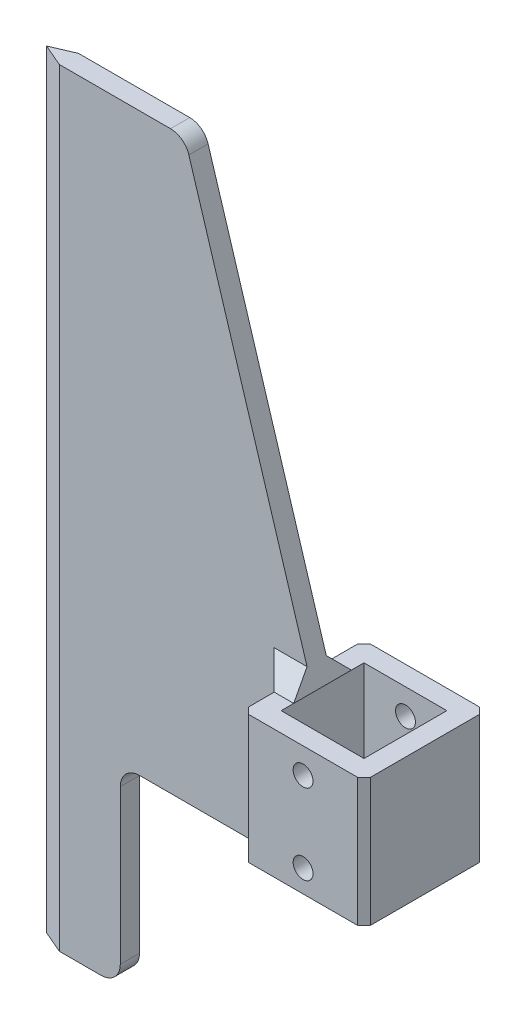
ISO-10303-21;
HEADER;
FILE_DESCRIPTION(('STEP AP214'),'2;1');
FILE_NAME('part.step','',(''),(''),'','','');
FILE_SCHEMA(('AUTOMOTIVE_DESIGN { 1 0 10303 214 1 1 1 1 }'));
ENDSEC;
DATA;
#1=APPLICATION_CONTEXT('core data for automotive mechanical design processes');
#2=APPLICATION_PROTOCOL_DEFINITION('international standard','automotive_design',2000,#1);
#3=PRODUCT_CONTEXT('',#1,'mechanical');
#4=PRODUCT('Part','Part','',(#3));
#5=PRODUCT_RELATED_PRODUCT_CATEGORY('part','',(#4));
#6=PRODUCT_DEFINITION_FORMATION('','',#4);
#7=PRODUCT_DEFINITION_CONTEXT('part definition',#1,'design');
#8=PRODUCT_DEFINITION('design','',#6,#7);
#9=PRODUCT_DEFINITION_SHAPE('','',#8);
#10=(LENGTH_UNIT() NAMED_UNIT(*) SI_UNIT(.MILLI.,.METRE.));
#11=(NAMED_UNIT(*) PLANE_ANGLE_UNIT() SI_UNIT($,.RADIAN.));
#12=(NAMED_UNIT(*) SI_UNIT($,.STERADIAN.) SOLID_ANGLE_UNIT());
#13=UNCERTAINTY_MEASURE_WITH_UNIT(LENGTH_MEASURE(1.E-05),#10,'distance_accuracy_value','');
#14=(GEOMETRIC_REPRESENTATION_CONTEXT(3) GLOBAL_UNCERTAINTY_ASSIGNED_CONTEXT((#13)) GLOBAL_UNIT_ASSIGNED_CONTEXT((#10,
#11,#12)) REPRESENTATION_CONTEXT('',''));
#15=CARTESIAN_POINT('',(0.,0.,0.));
#16=DIRECTION('',(0.,0.,1.));
#17=DIRECTION('',(1.,0.,0.));
#18=AXIS2_PLACEMENT_3D('',#15,#16,#17);
#19=CARTESIAN_POINT('',(3.04,0.,-11.));
#20=DIRECTION('',(0.,0.,1.));
#21=DIRECTION('',(0.,-1.,0.));
#22=AXIS2_PLACEMENT_3D('',#19,#20,#21);
#23=PLANE('',#22);
#24=DIRECTION('',(-1.,0.,0.));
#25=VECTOR('',#24,1.);
#26=CARTESIAN_POINT('',(0.,23.,-11.));
#27=LINE('',#26,#25);
#28=CARTESIAN_POINT('',(2.11692307692308,23.,-11.));
#29=VERTEX_POINT('',#28);
#30=CARTESIAN_POINT('',(-3.,23.,-11.));
#31=VERTEX_POINT('',#30);
#32=EDGE_CURVE('E437',#29,#31,#27,.T.);
#33=ORIENTED_EDGE('',*,*,#32,.T.);
#34=DIRECTION('',(0.,-1.,0.));
#35=VECTOR('',#34,1.);
#36=CARTESIAN_POINT('',(-3.,-4.74648450641009,-11.));
#37=LINE('',#36,#35);
#38=CARTESIAN_POINT('',(-3.,-4.74648450641009,-11.));
#39=VERTEX_POINT('',#38);
#40=EDGE_CURVE('E452',#31,#39,#37,.T.);
#41=ORIENTED_EDGE('',*,*,#40,.T.);
#42=DIRECTION('',(-1.,0.,0.));
#43=VECTOR('',#42,1.);
#44=CARTESIAN_POINT('',(3.04,-4.74648450641009,-11.));
#45=LINE('',#44,#43);
#46=CARTESIAN_POINT('',(-24.,-4.74648450641009,-11.));
#47=VERTEX_POINT('',#46);
#48=EDGE_CURVE('E300',#39,#47,#45,.T.);
#49=ORIENTED_EDGE('',*,*,#48,.T.);
#50=CARTESIAN_POINT('',(-24.,-7.7464845064101,-11.));
#51=DIRECTION('',(0.,0.,1.));
#52=DIRECTION('',(0.,-1.,0.));
#53=AXIS2_PLACEMENT_3D('',#50,#51,#52);
#54=CIRCLE('',#53,3.);
#55=CARTESIAN_POINT('',(-27.,-7.7464845064101,-11.));
#56=VERTEX_POINT('',#55);
#57=EDGE_CURVE('E397',#47,#56,#54,.T.);
#58=ORIENTED_EDGE('',*,*,#57,.T.);
#59=DIRECTION('',(0.,1.,0.));
#60=VECTOR('',#59,1.);
#61=CARTESIAN_POINT('',(-27.,-34.7464845064101,-11.));
#62=LINE('',#61,#60);
#63=CARTESIAN_POINT('',(-27.,-31.7464845064101,-11.));
#64=VERTEX_POINT('',#63);
#65=EDGE_CURVE('E288',#64,#56,#62,.T.);
#66=ORIENTED_EDGE('',*,*,#65,.F.);
#67=CARTESIAN_POINT('',(-30.,-31.7464845064101,-11.0000000000001));
#68=DIRECTION('',(0.,0.,1.));
#69=DIRECTION('',(0.,-1.,0.));
#70=AXIS2_PLACEMENT_3D('',#67,#68,#69);
#71=CIRCLE('',#70,3.);
#72=CARTESIAN_POINT('',(-30.,-34.7464845064101,-11.));
#73=VERTEX_POINT('',#72);
#74=EDGE_CURVE('E276',#64,#73,#71,.F.);
#75=ORIENTED_EDGE('',*,*,#74,.T.);
#76=DIRECTION('',(1.,0.,0.));
#77=VECTOR('',#76,1.);
#78=CARTESIAN_POINT('',(-40.,-34.7464845064101,-11.));
#79=LINE('',#78,#77);
#80=CARTESIAN_POINT('',(-36.5,-34.7464845064101,-11.));
#81=VERTEX_POINT('',#80);
#82=EDGE_CURVE('E269',#81,#73,#79,.T.);
#83=ORIENTED_EDGE('',*,*,#82,.F.);
#84=DIRECTION('',(0.,-1.,0.));
#85=VECTOR('',#84,1.);
#86=CARTESIAN_POINT('',(-36.5,94.2535154935899,-11.));
#87=LINE('',#86,#85);
#88=CARTESIAN_POINT('',(-36.5,85.,-11.));
#89=VERTEX_POINT('',#88);
#90=EDGE_CURVE('E253',#89,#81,#87,.T.);
#91=ORIENTED_EDGE('',*,*,#90,.F.);
#92=DIRECTION('',(-1.,0.,0.));
#93=VECTOR('',#92,1.);
#94=CARTESIAN_POINT('',(3.04,85.,-11.));
#95=LINE('',#94,#93);
#96=CARTESIAN_POINT('',(-19.1757239635543,85.,-11.));
#97=VERTEX_POINT('',#96);
#98=EDGE_CURVE('E301',#97,#89,#95,.T.);
#99=ORIENTED_EDGE('',*,*,#98,.F.);
#100=CARTESIAN_POINT('',(-19.1757239635543,82.,-11.));
#101=DIRECTION('',(0.,0.,1.));
#102=DIRECTION('',(0.,-1.,0.));
#103=AXIS2_PLACEMENT_3D('',#100,#101,#102);
#104=CIRCLE('',#103,3.);
#105=CARTESIAN_POINT('',(-16.3083869373885,82.8822575465126,-11.));
#106=VERTEX_POINT('',#105);
#107=EDGE_CURVE('E414',#97,#106,#104,.F.);
#108=ORIENTED_EDGE('',*,*,#107,.T.);
#109=DIRECTION('',(0.294085848837523,-0.95577900872195,0.));
#110=VECTOR('',#109,1.);
#111=CARTESIAN_POINT('',(8.66162162162162,1.72972972972974,-11.));
#112=LINE('',#111,#110);
#113=EDGE_CURVE('E295',#106,#29,#112,.T.);
#114=ORIENTED_EDGE('',*,*,#113,.T.);
#115=EDGE_LOOP('',(#33,#41,#49,#58,#66,#75,#83,#91,#99,#108,#114));
#116=FACE_BOUND('',#115,.T.);
#117=ADVANCED_FACE('F47',(#116),#23,.F.);
#118=CARTESIAN_POINT('',(3.04,85.,0.));
#119=DIRECTION('',(0.,1.,0.));
#120=DIRECTION('',(0.,0.,1.));
#121=AXIS2_PLACEMENT_3D('',#118,#119,#120);
#122=PLANE('',#121);
#123=DIRECTION('',(-1.,0.,0.));
#124=VECTOR('',#123,1.);
#125=CARTESIAN_POINT('',(3.04,85.,-7.99999999999999));
#126=LINE('',#125,#124);
#127=CARTESIAN_POINT('',(-19.1757239635543,85.,-7.99999999999999));
#128=VERTEX_POINT('',#127);
#129=CARTESIAN_POINT('',(-36.5,85.,-8.));
#130=VERTEX_POINT('',#129);
#131=EDGE_CURVE('E304',#128,#130,#126,.T.);
#132=ORIENTED_EDGE('',*,*,#131,.F.);
#133=DIRECTION('',(0.,0.,1.));
#134=VECTOR('',#133,1.);
#135=CARTESIAN_POINT('',(-19.1757239635543,85.,-11.));
#136=LINE('',#135,#134);
#137=EDGE_CURVE('E412',#128,#97,#136,.F.);
#138=ORIENTED_EDGE('',*,*,#137,.T.);
#139=ORIENTED_EDGE('',*,*,#98,.T.);
#140=DIRECTION('',(-0.919145030018058,0.,0.393919298579167));
#141=VECTOR('',#140,1.);
#142=CARTESIAN_POINT('',(-7.07827586206895,85.,-23.6093103448276));
#143=LINE('',#142,#141);
#144=CARTESIAN_POINT('',(-40.,85.,-9.50000000000001));
#145=VERTEX_POINT('',#144);
#146=EDGE_CURVE('E259',#89,#145,#143,.T.);
#147=ORIENTED_EDGE('',*,*,#146,.T.);
#148=DIRECTION('',(-0.919145030018058,0.,-0.393919298579167));
#149=VECTOR('',#148,1.);
#150=CARTESIAN_POINT('',(-0.198965517241368,85.,7.55758620689653));
#151=LINE('',#150,#149);
#152=EDGE_CURVE('E278',#130,#145,#151,.T.);
#153=ORIENTED_EDGE('',*,*,#152,.F.);
#154=EDGE_LOOP('',(#132,#138,#139,#147,#153));
#155=FACE_BOUND('',#154,.T.);
#156=ADVANCED_FACE('F598',(#155),#122,.T.);
#157=CARTESIAN_POINT('',(0.,-34.7464845064101,0.));
#158=DIRECTION('',(0.,-1.,0.));
#159=DIRECTION('',(0.,0.,-1.));
#160=AXIS2_PLACEMENT_3D('',#157,#158,#159);
#161=PLANE('',#160);
#162=ORIENTED_EDGE('',*,*,#82,.T.);
#163=DIRECTION('',(0.,0.,1.));
#164=VECTOR('',#163,1.);
#165=CARTESIAN_POINT('',(-30.,-34.7464845064101,-8.));
#166=LINE('',#165,#164);
#167=CARTESIAN_POINT('',(-30.,-34.7464845064101,-8.));
#168=VERTEX_POINT('',#167);
#169=EDGE_CURVE('E400',#73,#168,#166,.T.);
#170=ORIENTED_EDGE('',*,*,#169,.T.);
#171=DIRECTION('',(-1.,0.,0.));
#172=VECTOR('',#171,1.);
#173=CARTESIAN_POINT('',(-40.,-34.7464845064101,-8.));
#174=LINE('',#173,#172);
#175=CARTESIAN_POINT('',(-36.5,-34.7464845064101,-8.));
#176=VERTEX_POINT('',#175);
#177=EDGE_CURVE('E277',#168,#176,#174,.T.);
#178=ORIENTED_EDGE('',*,*,#177,.T.);
#179=DIRECTION('',(0.919145030018058,0.,0.393919298579167));
#180=VECTOR('',#179,1.);
#181=CARTESIAN_POINT('',(-2.76724137931033,-34.7464845064101,6.45689655172412));
#182=LINE('',#181,#180);
#183=CARTESIAN_POINT('',(-40.,-34.7464845064101,-9.50000000000001));
#184=VERTEX_POINT('',#183);
#185=EDGE_CURVE('E272',#184,#176,#182,.T.);
#186=ORIENTED_EDGE('',*,*,#185,.F.);
#187=DIRECTION('',(0.919145030018058,0.,-0.393919298579167));
#188=VECTOR('',#187,1.);
#189=CARTESIAN_POINT('',(-9.64655172413791,-34.7464845064101,-22.5086206896552));
#190=LINE('',#189,#188);
#191=EDGE_CURVE('E256',#184,#81,#190,.T.);
#192=ORIENTED_EDGE('',*,*,#191,.T.);
#193=EDGE_LOOP('',(#162,#170,#178,#186,#192));
#194=FACE_BOUND('',#193,.T.);
#195=ADVANCED_FACE('F267',(#194),#161,.T.);
#196=CARTESIAN_POINT('',(0.,20.,0.));
#197=DIRECTION('',(0.,-1.,0.));
#198=DIRECTION('',(0.,0.,-1.));
#199=AXIS2_PLACEMENT_3D('',#196,#197,#198);
#200=PLANE('',#199);
#201=DIRECTION('',(0.,0.,1.));
#202=VECTOR('',#201,1.);
#203=CARTESIAN_POINT('',(0.,20.,0.));
#204=LINE('',#203,#202);
#205=CARTESIAN_POINT('',(0.,20.,-5.));
#206=VERTEX_POINT('',#205);
#207=CARTESIAN_POINT('',(0.,20.,-1.));
#208=VERTEX_POINT('',#207);
#209=EDGE_CURVE('E367',#206,#208,#204,.T.);
#210=ORIENTED_EDGE('',*,*,#209,.T.);
#211=DIRECTION('',(-0.707106781186548,0.,-0.707106781186548));
#212=VECTOR('',#211,1.);
#213=CARTESIAN_POINT('',(1.,20.,0.));
#214=LINE('',#213,#212);
#215=CARTESIAN_POINT('',(1.,20.,0.));
#216=VERTEX_POINT('',#215);
#217=EDGE_CURVE('E499',#208,#216,#214,.F.);
#218=ORIENTED_EDGE('',*,*,#217,.T.);
#219=DIRECTION('',(1.,0.,0.));
#220=VECTOR('',#219,1.);
#221=CARTESIAN_POINT('',(0.,20.,0.));
#222=LINE('',#221,#220);
#223=CARTESIAN_POINT('',(18.,20.,0.));
#224=VERTEX_POINT('',#223);
#225=EDGE_CURVE('E366',#216,#224,#222,.T.);
#226=ORIENTED_EDGE('',*,*,#225,.T.);
#227=DIRECTION('',(-0.707106781186548,0.,0.707106781186547));
#228=VECTOR('',#227,1.);
#229=CARTESIAN_POINT('',(19.,20.,-1.));
#230=LINE('',#229,#228);
#231=CARTESIAN_POINT('',(19.,20.,-1.));
#232=VERTEX_POINT('',#231);
#233=EDGE_CURVE('E495',#224,#232,#230,.F.);
#234=ORIENTED_EDGE('',*,*,#233,.T.);
#235=DIRECTION('',(0.,0.,-1.));
#236=VECTOR('',#235,1.);
#237=CARTESIAN_POINT('',(19.,20.,0.));
#238=LINE('',#237,#236);
#239=CARTESIAN_POINT('',(19.,20.,-18.));
#240=VERTEX_POINT('',#239);
#241=EDGE_CURVE('E370',#232,#240,#238,.T.);
#242=ORIENTED_EDGE('',*,*,#241,.T.);
#243=DIRECTION('',(0.707106781186548,0.,0.707106781186548));
#244=VECTOR('',#243,1.);
#245=CARTESIAN_POINT('',(18.,20.,-19.));
#246=LINE('',#245,#244);
#247=CARTESIAN_POINT('',(18.,20.,-19.));
#248=VERTEX_POINT('',#247);
#249=EDGE_CURVE('E70',#240,#248,#246,.F.);
#250=ORIENTED_EDGE('',*,*,#249,.T.);
#251=DIRECTION('',(-1.,0.,0.));
#252=VECTOR('',#251,1.);
#253=CARTESIAN_POINT('',(0.,20.,-19.));
#254=LINE('',#253,#252);
#255=CARTESIAN_POINT('',(1.,20.,-19.));
#256=VERTEX_POINT('',#255);
#257=EDGE_CURVE('E372',#248,#256,#254,.T.);
#258=ORIENTED_EDGE('',*,*,#257,.T.);
#259=DIRECTION('',(0.707106781186547,0.,-0.707106781186548));
#260=VECTOR('',#259,1.);
#261=CARTESIAN_POINT('',(0.,20.,-18.));
#262=LINE('',#261,#260);
#263=CARTESIAN_POINT('',(0.,20.,-18.));
#264=VERTEX_POINT('',#263);
#265=EDGE_CURVE('E497',#256,#264,#262,.F.);
#266=ORIENTED_EDGE('',*,*,#265,.T.);
#267=CARTESIAN_POINT('',(0.,20.,-14.));
#268=VERTEX_POINT('',#267);
#269=EDGE_CURVE('E364',#264,#268,#204,.T.);
#270=ORIENTED_EDGE('',*,*,#269,.T.);
#271=DIRECTION('',(1.,0.,0.));
#272=VECTOR('',#271,1.);
#273=CARTESIAN_POINT('',(3.04,20.,-14.));
#274=LINE('',#273,#272);
#275=CARTESIAN_POINT('',(3.04,20.,-14.));
#276=VERTEX_POINT('',#275);
#277=EDGE_CURVE('E442',#268,#276,#274,.T.);
#278=ORIENTED_EDGE('',*,*,#277,.T.);
#279=DIRECTION('',(0.,0.,-1.));
#280=VECTOR('',#279,1.);
#281=CARTESIAN_POINT('',(3.04,20.,-3.04));
#282=LINE('',#281,#280);
#283=CARTESIAN_POINT('',(3.04,20.,-15.96));
#284=VERTEX_POINT('',#283);
#285=EDGE_CURVE('E313',#276,#284,#282,.T.);
#286=ORIENTED_EDGE('',*,*,#285,.T.);
#287=DIRECTION('',(1.,0.,0.));
#288=VECTOR('',#287,1.);
#289=CARTESIAN_POINT('',(3.04,20.,-15.96));
#290=LINE('',#289,#288);
#291=CARTESIAN_POINT('',(15.96,20.,-15.96));
#292=VERTEX_POINT('',#291);
#293=EDGE_CURVE('E312',#284,#292,#290,.T.);
#294=ORIENTED_EDGE('',*,*,#293,.T.);
#295=DIRECTION('',(0.,0.,1.));
#296=VECTOR('',#295,1.);
#297=CARTESIAN_POINT('',(15.96,20.,-3.04));
#298=LINE('',#297,#296);
#299=CARTESIAN_POINT('',(15.96,20.,-3.04));
#300=VERTEX_POINT('',#299);
#301=EDGE_CURVE('E316',#292,#300,#298,.T.);
#302=ORIENTED_EDGE('',*,*,#301,.T.);
#303=DIRECTION('',(-1.,0.,0.));
#304=VECTOR('',#303,1.);
#305=CARTESIAN_POINT('',(3.04,20.,-3.04));
#306=LINE('',#305,#304);
#307=CARTESIAN_POINT('',(3.04,20.,-3.04));
#308=VERTEX_POINT('',#307);
#309=EDGE_CURVE('E319',#300,#308,#306,.T.);
#310=ORIENTED_EDGE('',*,*,#309,.T.);
#311=CARTESIAN_POINT('',(3.04,20.,-5.));
#312=VERTEX_POINT('',#311);
#313=EDGE_CURVE('E309',#308,#312,#282,.T.);
#314=ORIENTED_EDGE('',*,*,#313,.T.);
#315=DIRECTION('',(-1.,0.,0.));
#316=VECTOR('',#315,1.);
#317=CARTESIAN_POINT('',(0.,20.,-5.));
#318=LINE('',#317,#316);
#319=EDGE_CURVE('E439',#312,#206,#318,.T.);
#320=ORIENTED_EDGE('',*,*,#319,.T.);
#321=EDGE_LOOP('',(#210,#218,#226,#234,#242,#250,#258,#266,#270,#278,#286,#294,#302,#310,#314,#320));
#322=FACE_BOUND('',#321,.T.);
#323=ADVANCED_FACE('F515',(#322),#200,.F.);
#324=CARTESIAN_POINT('',(0.,0.,0.));
#325=DIRECTION('',(0.,-1.,0.));
#326=DIRECTION('',(0.,0.,-1.));
#327=AXIS2_PLACEMENT_3D('',#324,#325,#326);
#328=PLANE('',#327);
#329=DIRECTION('',(1.,0.,0.));
#330=VECTOR('',#329,1.);
#331=CARTESIAN_POINT('',(0.,0.,0.));
#332=LINE('',#331,#330);
#333=CARTESIAN_POINT('',(1.,0.,0.));
#334=VERTEX_POINT('',#333);
#335=CARTESIAN_POINT('',(18.,0.,0.));
#336=VERTEX_POINT('',#335);
#337=EDGE_CURVE('E377',#334,#336,#332,.T.);
#338=ORIENTED_EDGE('',*,*,#337,.F.);
#339=DIRECTION('',(0.707106781186548,0.,0.707106781186548));
#340=VECTOR('',#339,1.);
#341=CARTESIAN_POINT('',(0.5,0.,-0.5));
#342=LINE('',#341,#340);
#343=CARTESIAN_POINT('',(0.,0.,-1.));
#344=VERTEX_POINT('',#343);
#345=EDGE_CURVE('E490',#334,#344,#342,.F.);
#346=ORIENTED_EDGE('',*,*,#345,.T.);
#347=DIRECTION('',(0.,0.,1.));
#348=VECTOR('',#347,1.);
#349=CARTESIAN_POINT('',(0.,0.,0.));
#350=LINE('',#349,#348);
#351=CARTESIAN_POINT('',(0.,0.,-3.25));
#352=VERTEX_POINT('',#351);
#353=EDGE_CURVE('E363',#352,#344,#350,.T.);
#354=ORIENTED_EDGE('',*,*,#353,.F.);
#355=DIRECTION('',(1.,0.,0.));
#356=VECTOR('',#355,1.);
#357=CARTESIAN_POINT('',(3.04,0.,-3.25));
#358=LINE('',#357,#356);
#359=CARTESIAN_POINT('',(3.04,0.,-3.25));
#360=VERTEX_POINT('',#359);
#361=EDGE_CURVE('E419',#352,#360,#358,.T.);
#362=ORIENTED_EDGE('',*,*,#361,.T.);
#363=DIRECTION('',(0.,0.,-1.));
#364=VECTOR('',#363,1.);
#365=CARTESIAN_POINT('',(3.04,0.,-3.04));
#366=LINE('',#365,#364);
#367=CARTESIAN_POINT('',(3.04,0.,-3.04));
#368=VERTEX_POINT('',#367);
#369=EDGE_CURVE('E323',#368,#360,#366,.T.);
#370=ORIENTED_EDGE('',*,*,#369,.F.);
#371=DIRECTION('',(-1.,0.,0.));
#372=VECTOR('',#371,1.);
#373=CARTESIAN_POINT('',(3.04,0.,-3.04));
#374=LINE('',#373,#372);
#375=CARTESIAN_POINT('',(15.96,0.,-3.04));
#376=VERTEX_POINT('',#375);
#377=EDGE_CURVE('E332',#376,#368,#374,.T.);
#378=ORIENTED_EDGE('',*,*,#377,.F.);
#379=DIRECTION('',(0.,0.,1.));
#380=VECTOR('',#379,1.);
#381=CARTESIAN_POINT('',(15.96,0.,-3.04));
#382=LINE('',#381,#380);
#383=CARTESIAN_POINT('',(15.96,0.,-15.96));
#384=VERTEX_POINT('',#383);
#385=EDGE_CURVE('E329',#384,#376,#382,.T.);
#386=ORIENTED_EDGE('',*,*,#385,.F.);
#387=DIRECTION('',(1.,0.,0.));
#388=VECTOR('',#387,1.);
#389=CARTESIAN_POINT('',(3.04,0.,-15.96));
#390=LINE('',#389,#388);
#391=CARTESIAN_POINT('',(3.04,0.,-15.96));
#392=VERTEX_POINT('',#391);
#393=EDGE_CURVE('E326',#392,#384,#390,.T.);
#394=ORIENTED_EDGE('',*,*,#393,.F.);
#395=CARTESIAN_POINT('',(3.04,0.,-15.75));
#396=VERTEX_POINT('',#395);
#397=EDGE_CURVE('E303',#396,#392,#366,.T.);
#398=ORIENTED_EDGE('',*,*,#397,.F.);
#399=DIRECTION('',(-1.,0.,0.));
#400=VECTOR('',#399,1.);
#401=CARTESIAN_POINT('',(0.,0.,-15.75));
#402=LINE('',#401,#400);
#403=CARTESIAN_POINT('',(0.,0.,-15.75));
#404=VERTEX_POINT('',#403);
#405=EDGE_CURVE('E416',#396,#404,#402,.T.);
#406=ORIENTED_EDGE('',*,*,#405,.T.);
#407=CARTESIAN_POINT('',(0.,0.,-18.));
#408=VERTEX_POINT('',#407);
#409=EDGE_CURVE('E375',#408,#404,#350,.T.);
#410=ORIENTED_EDGE('',*,*,#409,.F.);
#411=DIRECTION('',(-0.707106781186547,0.,0.707106781186548));
#412=VECTOR('',#411,1.);
#413=CARTESIAN_POINT('',(-9.,0.,-8.99999999999999));
#414=LINE('',#413,#412);
#415=CARTESIAN_POINT('',(1.,0.,-19.));
#416=VERTEX_POINT('',#415);
#417=EDGE_CURVE('E488',#408,#416,#414,.F.);
#418=ORIENTED_EDGE('',*,*,#417,.T.);
#419=DIRECTION('',(-1.,0.,0.));
#420=VECTOR('',#419,1.);
#421=CARTESIAN_POINT('',(0.,0.,-19.));
#422=LINE('',#421,#420);
#423=CARTESIAN_POINT('',(18.,0.,-19.));
#424=VERTEX_POINT('',#423);
#425=EDGE_CURVE('E383',#424,#416,#422,.T.);
#426=ORIENTED_EDGE('',*,*,#425,.F.);
#427=DIRECTION('',(-0.707106781186548,0.,-0.707106781186548));
#428=VECTOR('',#427,1.);
#429=CARTESIAN_POINT('',(18.5,0.,-18.5));
#430=LINE('',#429,#428);
#431=CARTESIAN_POINT('',(19.,0.,-18.));
#432=VERTEX_POINT('',#431);
#433=EDGE_CURVE('E484',#424,#432,#430,.F.);
#434=ORIENTED_EDGE('',*,*,#433,.T.);
#435=DIRECTION('',(0.,0.,-1.));
#436=VECTOR('',#435,1.);
#437=CARTESIAN_POINT('',(19.,0.,0.));
#438=LINE('',#437,#436);
#439=CARTESIAN_POINT('',(19.,0.,-1.));
#440=VERTEX_POINT('',#439);
#441=EDGE_CURVE('E380',#440,#432,#438,.T.);
#442=ORIENTED_EDGE('',*,*,#441,.F.);
#443=DIRECTION('',(0.707106781186548,0.,-0.707106781186547));
#444=VECTOR('',#443,1.);
#445=CARTESIAN_POINT('',(8.99999999999999,0.,9.));
#446=LINE('',#445,#444);
#447=EDGE_CURVE('E486',#440,#336,#446,.F.);
#448=ORIENTED_EDGE('',*,*,#447,.T.);
#449=EDGE_LOOP('',(#338,#346,#354,#362,#370,#378,#386,#394,#398,#406,#410,#418,#426,#434,#442,#448));
#450=FACE_BOUND('',#449,.T.);
#451=ADVANCED_FACE('F522',(#450),#328,.T.);
#452=CARTESIAN_POINT('',(0.,20.,0.));
#453=DIRECTION('',(1.,0.,0.));
#454=DIRECTION('',(0.,0.,-1.));
#455=AXIS2_PLACEMENT_3D('',#452,#453,#454);
#456=PLANE('',#455);
#457=ORIENTED_EDGE('',*,*,#269,.F.);
#458=DIRECTION('',(0.,-1.,0.));
#459=VECTOR('',#458,1.);
#460=CARTESIAN_POINT('',(0.,20.,-18.));
#461=LINE('',#460,#459);
#462=EDGE_CURVE('E501',#264,#408,#461,.T.);
#463=ORIENTED_EDGE('',*,*,#462,.T.);
#464=ORIENTED_EDGE('',*,*,#409,.T.);
#465=DIRECTION('',(0.,-0.707106781186548,0.707106781186547));
#466=VECTOR('',#465,1.);
#467=CARTESIAN_POINT('',(0.,2.12499999999999,-17.875));
#468=LINE('',#467,#466);
#469=CARTESIAN_POINT('',(0.,-1.75,-14.));
#470=VERTEX_POINT('',#469);
#471=EDGE_CURVE('E429',#404,#470,#468,.T.);
#472=ORIENTED_EDGE('',*,*,#471,.T.);
#473=DIRECTION('',(0.,1.,0.));
#474=VECTOR('',#473,1.);
#475=CARTESIAN_POINT('',(0.,23.,-14.));
#476=LINE('',#475,#474);
#477=EDGE_CURVE('E455',#470,#268,#476,.T.);
#478=ORIENTED_EDGE('',*,*,#477,.T.);
#479=EDGE_LOOP('',(#457,#463,#464,#472,#478));
#480=FACE_BOUND('',#479,.T.);
#481=ADVANCED_FACE('F530',(#480),#456,.F.);
#482=ORIENTED_EDGE('',*,*,#353,.T.);
#483=DIRECTION('',(0.,1.,0.));
#484=VECTOR('',#483,1.);
#485=CARTESIAN_POINT('',(0.,20.,-1.));
#486=LINE('',#485,#484);
#487=EDGE_CURVE('E492',#344,#208,#486,.T.);
#488=ORIENTED_EDGE('',*,*,#487,.T.);
#489=ORIENTED_EDGE('',*,*,#209,.F.);
#490=DIRECTION('',(0.,-1.,0.));
#491=VECTOR('',#490,1.);
#492=CARTESIAN_POINT('',(0.,20.,-5.));
#493=LINE('',#492,#491);
#494=CARTESIAN_POINT('',(0.,-1.75,-5.));
#495=VERTEX_POINT('',#494);
#496=EDGE_CURVE('E458',#206,#495,#493,.T.);
#497=ORIENTED_EDGE('',*,*,#496,.T.);
#498=DIRECTION('',(0.,-0.707106781186548,-0.707106781186548));
#499=VECTOR('',#498,1.);
#500=CARTESIAN_POINT('',(0.,11.625,8.375));
#501=LINE('',#500,#499);
#502=EDGE_CURVE('E427',#495,#352,#501,.F.);
#503=ORIENTED_EDGE('',*,*,#502,.T.);
#504=EDGE_LOOP('',(#482,#488,#489,#497,#503));
#505=FACE_BOUND('',#504,.T.);
#506=ADVANCED_FACE('F569',(#505),#456,.F.);
#507=CARTESIAN_POINT('',(0.,20.,0.));
#508=DIRECTION('',(0.,0.,-1.));
#509=DIRECTION('',(-1.,0.,0.));
#510=AXIS2_PLACEMENT_3D('',#507,#508,#509);
#511=PLANE('',#510);
#512=CARTESIAN_POINT('',(9.5,16.,0.));
#513=DIRECTION('',(0.,0.,1.));
#514=DIRECTION('',(1.,0.,0.));
#515=AXIS2_PLACEMENT_3D('',#512,#513,#514);
#516=CIRCLE('',#515,1.55);
#517=CARTESIAN_POINT('',(11.05,16.,0.));
#518=VERTEX_POINT('',#517);
#519=EDGE_CURVE('E352',#518,#518,#516,.T.);
#520=ORIENTED_EDGE('',*,*,#519,.F.);
#521=EDGE_LOOP('',(#520));
#522=FACE_BOUND('',#521,.T.);
#523=CARTESIAN_POINT('',(9.5,3.5,0.));
#524=DIRECTION('',(0.,0.,1.));
#525=DIRECTION('',(1.,0.,0.));
#526=AXIS2_PLACEMENT_3D('',#523,#524,#525);
#527=CIRCLE('',#526,1.55);
#528=CARTESIAN_POINT('',(11.05,3.5,0.));
#529=VERTEX_POINT('',#528);
#530=EDGE_CURVE('E351',#529,#529,#527,.T.);
#531=ORIENTED_EDGE('',*,*,#530,.F.);
#532=EDGE_LOOP('',(#531));
#533=FACE_BOUND('',#532,.T.);
#534=ORIENTED_EDGE('',*,*,#225,.F.);
#535=DIRECTION('',(0.,-1.,0.));
#536=VECTOR('',#535,1.);
#537=CARTESIAN_POINT('',(1.,20.,0.));
#538=LINE('',#537,#536);
#539=EDGE_CURVE('E481',#216,#334,#538,.T.);
#540=ORIENTED_EDGE('',*,*,#539,.T.);
#541=ORIENTED_EDGE('',*,*,#337,.T.);
#542=DIRECTION('',(0.,1.,0.));
#543=VECTOR('',#542,1.);
#544=CARTESIAN_POINT('',(18.,20.,0.));
#545=LINE('',#544,#543);
#546=EDGE_CURVE('E479',#336,#224,#545,.T.);
#547=ORIENTED_EDGE('',*,*,#546,.T.);
#548=EDGE_LOOP('',(#534,#540,#541,#547));
#549=FACE_BOUND('',#548,.T.);
#550=ADVANCED_FACE('F586',(#522,#533,#549),#511,.F.);
#551=CARTESIAN_POINT('',(19.,20.,0.));
#552=DIRECTION('',(-1.,0.,0.));
#553=DIRECTION('',(0.,0.,1.));
#554=AXIS2_PLACEMENT_3D('',#551,#552,#553);
#555=PLANE('',#554);
#556=ORIENTED_EDGE('',*,*,#241,.F.);
#557=DIRECTION('',(0.,-1.,0.));
#558=VECTOR('',#557,1.);
#559=CARTESIAN_POINT('',(19.,20.,-1.));
#560=LINE('',#559,#558);
#561=EDGE_CURVE('E13',#232,#440,#560,.T.);
#562=ORIENTED_EDGE('',*,*,#561,.T.);
#563=ORIENTED_EDGE('',*,*,#441,.T.);
#564=DIRECTION('',(0.,1.,0.));
#565=VECTOR('',#564,1.);
#566=CARTESIAN_POINT('',(19.,20.,-18.));
#567=LINE('',#566,#565);
#568=EDGE_CURVE('E56',#432,#240,#567,.T.);
#569=ORIENTED_EDGE('',*,*,#568,.T.);
#570=EDGE_LOOP('',(#556,#562,#563,#569));
#571=FACE_BOUND('',#570,.T.);
#572=ADVANCED_FACE('F510',(#571),#555,.F.);
#573=CARTESIAN_POINT('',(0.,20.,-19.));
#574=DIRECTION('',(0.,0.,1.));
#575=DIRECTION('',(1.,0.,0.));
#576=AXIS2_PLACEMENT_3D('',#573,#574,#575);
#577=PLANE('',#576);
#578=CARTESIAN_POINT('',(9.5,16.,-19.));
#579=DIRECTION('',(0.,0.,1.));
#580=DIRECTION('',(1.,0.,0.));
#581=AXIS2_PLACEMENT_3D('',#578,#579,#580);
#582=CIRCLE('',#581,1.55);
#583=CARTESIAN_POINT('',(11.05,16.,-19.));
#584=VERTEX_POINT('',#583);
#585=EDGE_CURVE('E360',#584,#584,#582,.T.);
#586=ORIENTED_EDGE('',*,*,#585,.T.);
#587=EDGE_LOOP('',(#586));
#588=FACE_BOUND('',#587,.T.);
#589=CARTESIAN_POINT('',(9.5,3.5,-19.));
#590=DIRECTION('',(0.,0.,1.));
#591=DIRECTION('',(1.,0.,0.));
#592=AXIS2_PLACEMENT_3D('',#589,#590,#591);
#593=CIRCLE('',#592,1.55);
#594=CARTESIAN_POINT('',(11.05,3.5,-19.));
#595=VERTEX_POINT('',#594);
#596=EDGE_CURVE('E355',#595,#595,#593,.T.);
#597=ORIENTED_EDGE('',*,*,#596,.T.);
#598=EDGE_LOOP('',(#597));
#599=FACE_BOUND('',#598,.T.);
#600=ORIENTED_EDGE('',*,*,#425,.T.);
#601=DIRECTION('',(0.,1.,0.));
#602=VECTOR('',#601,1.);
#603=CARTESIAN_POINT('',(1.,20.,-19.));
#604=LINE('',#603,#602);
#605=EDGE_CURVE('E63',#416,#256,#604,.T.);
#606=ORIENTED_EDGE('',*,*,#605,.T.);
#607=ORIENTED_EDGE('',*,*,#257,.F.);
#608=DIRECTION('',(0.,-1.,0.));
#609=VECTOR('',#608,1.);
#610=CARTESIAN_POINT('',(18.,20.,-19.));
#611=LINE('',#610,#609);
#612=EDGE_CURVE('E504',#248,#424,#611,.T.);
#613=ORIENTED_EDGE('',*,*,#612,.T.);
#614=EDGE_LOOP('',(#600,#606,#607,#613));
#615=FACE_BOUND('',#614,.T.);
#616=ADVANCED_FACE('F519',(#588,#599,#615),#577,.F.);
#617=CARTESIAN_POINT('',(9.5,3.5,-22.));
#618=DIRECTION('',(0.,0.,1.));
#619=DIRECTION('',(1.,0.,0.));
#620=AXIS2_PLACEMENT_3D('',#617,#618,#619);
#621=CYLINDRICAL_SURFACE('',#620,1.55);
#622=CARTESIAN_POINT('',(9.5,3.5,-15.96));
#623=DIRECTION('',(0.,0.,-1.));
#624=DIRECTION('',(-1.,0.,0.));
#625=AXIS2_PLACEMENT_3D('',#622,#623,#624);
#626=CIRCLE('',#625,1.55);
#627=CARTESIAN_POINT('',(7.95,3.5,-15.96));
#628=VERTEX_POINT('',#627);
#629=EDGE_CURVE('E348',#628,#628,#626,.F.);
#630=ORIENTED_EDGE('',*,*,#629,.T.);
#631=EDGE_LOOP('',(#630));
#632=FACE_BOUND('',#631,.T.);
#633=ORIENTED_EDGE('',*,*,#596,.F.);
#634=EDGE_LOOP('',(#633));
#635=FACE_BOUND('',#634,.T.);
#636=ADVANCED_FACE('F630',(#632,#635),#621,.F.);
#637=CARTESIAN_POINT('',(9.5,16.,-22.));
#638=DIRECTION('',(0.,0.,1.));
#639=DIRECTION('',(1.,0.,0.));
#640=AXIS2_PLACEMENT_3D('',#637,#638,#639);
#641=CYLINDRICAL_SURFACE('',#640,1.55);
#642=CARTESIAN_POINT('',(9.5,16.,-15.96));
#643=DIRECTION('',(0.,0.,-1.));
#644=DIRECTION('',(-1.,0.,0.));
#645=AXIS2_PLACEMENT_3D('',#642,#643,#644);
#646=CIRCLE('',#645,1.55);
#647=CARTESIAN_POINT('',(7.95,16.,-15.96));
#648=VERTEX_POINT('',#647);
#649=EDGE_CURVE('E347',#648,#648,#646,.F.);
#650=ORIENTED_EDGE('',*,*,#649,.T.);
#651=EDGE_LOOP('',(#650));
#652=FACE_BOUND('',#651,.T.);
#653=ORIENTED_EDGE('',*,*,#585,.F.);
#654=EDGE_LOOP('',(#653));
#655=FACE_BOUND('',#654,.T.);
#656=ADVANCED_FACE('F626',(#652,#655),#641,.F.);
#657=CARTESIAN_POINT('',(9.5,3.5,-3.04));
#658=DIRECTION('',(0.,0.,1.));
#659=DIRECTION('',(1.,0.,0.));
#660=AXIS2_PLACEMENT_3D('',#657,#658,#659);
#661=CIRCLE('',#660,1.55);
#662=CARTESIAN_POINT('',(11.05,3.5,-3.04));
#663=VERTEX_POINT('',#662);
#664=EDGE_CURVE('E344',#663,#663,#661,.F.);
#665=ORIENTED_EDGE('',*,*,#664,.T.);
#666=EDGE_LOOP('',(#665));
#667=FACE_BOUND('',#666,.T.);
#668=ORIENTED_EDGE('',*,*,#530,.T.);
#669=EDGE_LOOP('',(#668));
#670=FACE_BOUND('',#669,.T.);
#671=ADVANCED_FACE('F629',(#667,#670),#621,.F.);
#672=CARTESIAN_POINT('',(9.5,16.,-3.04));
#673=DIRECTION('',(0.,0.,1.));
#674=DIRECTION('',(1.,0.,0.));
#675=AXIS2_PLACEMENT_3D('',#672,#673,#674);
#676=CIRCLE('',#675,1.55);
#677=CARTESIAN_POINT('',(11.05,16.,-3.04));
#678=VERTEX_POINT('',#677);
#679=EDGE_CURVE('E337',#678,#678,#676,.F.);
#680=ORIENTED_EDGE('',*,*,#679,.T.);
#681=EDGE_LOOP('',(#680));
#682=FACE_BOUND('',#681,.T.);
#683=ORIENTED_EDGE('',*,*,#519,.T.);
#684=EDGE_LOOP('',(#683));
#685=FACE_BOUND('',#684,.T.);
#686=ADVANCED_FACE('F622',(#682,#685),#641,.F.);
#687=CARTESIAN_POINT('',(3.04,20.,-15.96));
#688=DIRECTION('',(0.,0.,-1.));
#689=DIRECTION('',(-1.,0.,0.));
#690=AXIS2_PLACEMENT_3D('',#687,#688,#689);
#691=PLANE('',#690);
#692=ORIENTED_EDGE('',*,*,#649,.F.);
#693=EDGE_LOOP('',(#692));
#694=FACE_BOUND('',#693,.T.);
#695=ORIENTED_EDGE('',*,*,#393,.T.);
#696=DIRECTION('',(0.,-1.,0.));
#697=VECTOR('',#696,1.);
#698=CARTESIAN_POINT('',(15.96,20.,-15.96));
#699=LINE('',#698,#697);
#700=EDGE_CURVE('E340',#292,#384,#699,.T.);
#701=ORIENTED_EDGE('',*,*,#700,.F.);
#702=ORIENTED_EDGE('',*,*,#293,.F.);
#703=DIRECTION('',(0.,-1.,0.));
#704=VECTOR('',#703,1.);
#705=CARTESIAN_POINT('',(3.04,20.,-15.96));
#706=LINE('',#705,#704);
#707=EDGE_CURVE('E322',#284,#392,#706,.T.);
#708=ORIENTED_EDGE('',*,*,#707,.T.);
#709=EDGE_LOOP('',(#695,#701,#702,#708));
#710=FACE_BOUND('',#709,.T.);
#711=ORIENTED_EDGE('',*,*,#629,.F.);
#712=EDGE_LOOP('',(#711));
#713=FACE_BOUND('',#712,.T.);
#714=ADVANCED_FACE('F614',(#694,#710,#713),#691,.F.);
#715=CARTESIAN_POINT('',(3.04,20.,-3.04));
#716=DIRECTION('',(0.,0.,1.));
#717=DIRECTION('',(1.,0.,0.));
#718=AXIS2_PLACEMENT_3D('',#715,#716,#717);
#719=PLANE('',#718);
#720=ORIENTED_EDGE('',*,*,#679,.F.);
#721=EDGE_LOOP('',(#720));
#722=FACE_BOUND('',#721,.T.);
#723=ORIENTED_EDGE('',*,*,#377,.T.);
#724=DIRECTION('',(0.,-1.,0.));
#725=VECTOR('',#724,1.);
#726=CARTESIAN_POINT('',(3.04,20.,-3.04));
#727=LINE('',#726,#725);
#728=EDGE_CURVE('E335',#308,#368,#727,.T.);
#729=ORIENTED_EDGE('',*,*,#728,.F.);
#730=ORIENTED_EDGE('',*,*,#309,.F.);
#731=DIRECTION('',(0.,-1.,0.));
#732=VECTOR('',#731,1.);
#733=CARTESIAN_POINT('',(15.96,20.,-3.04));
#734=LINE('',#733,#732);
#735=EDGE_CURVE('E338',#300,#376,#734,.T.);
#736=ORIENTED_EDGE('',*,*,#735,.T.);
#737=EDGE_LOOP('',(#723,#729,#730,#736));
#738=FACE_BOUND('',#737,.T.);
#739=ORIENTED_EDGE('',*,*,#664,.F.);
#740=EDGE_LOOP('',(#739));
#741=FACE_BOUND('',#740,.T.);
#742=ADVANCED_FACE('F611',(#722,#738,#741),#719,.F.);
#743=CARTESIAN_POINT('',(3.04,20.,-3.04));
#744=DIRECTION('',(-1.,0.,0.));
#745=DIRECTION('',(0.,0.,1.));
#746=AXIS2_PLACEMENT_3D('',#743,#744,#745);
#747=PLANE('',#746);
#748=ORIENTED_EDGE('',*,*,#285,.F.);
#749=DIRECTION('',(0.,0.,1.));
#750=VECTOR('',#749,1.);
#751=CARTESIAN_POINT('',(3.04,20.,-48.));
#752=LINE('',#751,#750);
#753=EDGE_CURVE('E293',#276,#312,#752,.T.);
#754=ORIENTED_EDGE('',*,*,#753,.T.);
#755=ORIENTED_EDGE('',*,*,#313,.F.);
#756=ORIENTED_EDGE('',*,*,#728,.T.);
#757=ORIENTED_EDGE('',*,*,#369,.T.);
#758=DIRECTION('',(0.,0.707106781186548,0.707106781186548));
#759=VECTOR('',#758,1.);
#760=CARTESIAN_POINT('',(3.04,10.105,6.855));
#761=LINE('',#760,#759);
#762=CARTESIAN_POINT('',(3.04,-4.74648450641009,-7.99648450641009));
#763=VERTEX_POINT('',#762);
#764=EDGE_CURVE('E422',#360,#763,#761,.F.);
#765=ORIENTED_EDGE('',*,*,#764,.T.);
#766=DIRECTION('',(0.,0.,1.));
#767=VECTOR('',#766,1.);
#768=CARTESIAN_POINT('',(3.04,-4.74648450641009,0.));
#769=LINE('',#768,#767);
#770=CARTESIAN_POINT('',(3.04,-4.74648450641009,-11.0035154935899));
#771=VERTEX_POINT('',#770);
#772=EDGE_CURVE('E298',#771,#763,#769,.T.);
#773=ORIENTED_EDGE('',*,*,#772,.F.);
#774=DIRECTION('',(0.,0.707106781186548,-0.707106781186547));
#775=VECTOR('',#774,1.);
#776=CARTESIAN_POINT('',(3.04,3.64499999999998,-19.395));
#777=LINE('',#776,#775);
#778=EDGE_CURVE('E435',#771,#396,#777,.T.);
#779=ORIENTED_EDGE('',*,*,#778,.T.);
#780=ORIENTED_EDGE('',*,*,#397,.T.);
#781=ORIENTED_EDGE('',*,*,#707,.F.);
#782=EDGE_LOOP('',(#748,#754,#755,#756,#757,#765,#773,#779,#780,#781));
#783=FACE_BOUND('',#782,.T.);
#784=ADVANCED_FACE('F540',(#783),#747,.F.);
#785=CARTESIAN_POINT('',(15.96,20.,-3.04));
#786=DIRECTION('',(1.,0.,0.));
#787=DIRECTION('',(0.,0.,-1.));
#788=AXIS2_PLACEMENT_3D('',#785,#786,#787);
#789=PLANE('',#788);
#790=ORIENTED_EDGE('',*,*,#385,.T.);
#791=ORIENTED_EDGE('',*,*,#735,.F.);
#792=ORIENTED_EDGE('',*,*,#301,.F.);
#793=ORIENTED_EDGE('',*,*,#700,.T.);
#794=EDGE_LOOP('',(#790,#791,#792,#793));
#795=FACE_BOUND('',#794,.T.);
#796=ADVANCED_FACE('F616',(#795),#789,.F.);
#797=CARTESIAN_POINT('',(3.04,0.,-8.));
#798=DIRECTION('',(0.,0.,1.));
#799=DIRECTION('',(1.,0.,0.));
#800=AXIS2_PLACEMENT_3D('',#797,#798,#799);
#801=PLANE('',#800);
#802=DIRECTION('',(-1.,0.,0.));
#803=VECTOR('',#802,1.);
#804=CARTESIAN_POINT('',(3.04,-4.74648450641009,-8.));
#805=LINE('',#804,#803);
#806=CARTESIAN_POINT('',(-3.,-4.74648450641009,-8.));
#807=VERTEX_POINT('',#806);
#808=CARTESIAN_POINT('',(-24.,-4.74648450641009,-8.));
#809=VERTEX_POINT('',#808);
#810=EDGE_CURVE('E306',#807,#809,#805,.T.);
#811=ORIENTED_EDGE('',*,*,#810,.F.);
#812=DIRECTION('',(0.,1.,0.));
#813=VECTOR('',#812,1.);
#814=CARTESIAN_POINT('',(-3.,0.,-8.));
#815=LINE('',#814,#813);
#816=CARTESIAN_POINT('',(-3.,23.,-8.));
#817=VERTEX_POINT('',#816);
#818=EDGE_CURVE('E461',#807,#817,#815,.T.);
#819=ORIENTED_EDGE('',*,*,#818,.T.);
#820=DIRECTION('',(1.,0.,0.));
#821=VECTOR('',#820,1.);
#822=CARTESIAN_POINT('',(3.04,23.,-8.));
#823=LINE('',#822,#821);
#824=CARTESIAN_POINT('',(2.11692307692308,23.,-8.));
#825=VERTEX_POINT('',#824);
#826=EDGE_CURVE('E445',#817,#825,#823,.T.);
#827=ORIENTED_EDGE('',*,*,#826,.T.);
#828=DIRECTION('',(0.294085848837523,-0.95577900872195,0.));
#829=VECTOR('',#828,1.);
#830=CARTESIAN_POINT('',(-16.96,85.,-8.));
#831=LINE('',#830,#829);
#832=CARTESIAN_POINT('',(-16.3083869373885,82.8822575465126,-8.));
#833=VERTEX_POINT('',#832);
#834=EDGE_CURVE('E290',#833,#825,#831,.T.);
#835=ORIENTED_EDGE('',*,*,#834,.F.);
#836=CARTESIAN_POINT('',(-19.1757239635543,82.,-8.));
#837=DIRECTION('',(0.,0.,1.));
#838=DIRECTION('',(1.,0.,0.));
#839=AXIS2_PLACEMENT_3D('',#836,#837,#838);
#840=CIRCLE('',#839,3.);
#841=EDGE_CURVE('E410',#833,#128,#840,.T.);
#842=ORIENTED_EDGE('',*,*,#841,.T.);
#843=ORIENTED_EDGE('',*,*,#131,.T.);
#844=DIRECTION('',(0.,-1.,0.));
#845=VECTOR('',#844,1.);
#846=CARTESIAN_POINT('',(-36.5,94.2535154935899,-8.));
#847=LINE('',#846,#845);
#848=EDGE_CURVE('E283',#130,#176,#847,.T.);
#849=ORIENTED_EDGE('',*,*,#848,.T.);
#850=ORIENTED_EDGE('',*,*,#177,.F.);
#851=CARTESIAN_POINT('',(-30.,-31.7464845064101,-8.));
#852=DIRECTION('',(0.,0.,1.));
#853=DIRECTION('',(1.,0.,0.));
#854=AXIS2_PLACEMENT_3D('',#851,#852,#853);
#855=CIRCLE('',#854,3.);
#856=CARTESIAN_POINT('',(-27.,-31.7464845064101,-8.));
#857=VERTEX_POINT('',#856);
#858=EDGE_CURVE('E402',#168,#857,#855,.T.);
#859=ORIENTED_EDGE('',*,*,#858,.T.);
#860=DIRECTION('',(0.,1.,0.));
#861=VECTOR('',#860,1.);
#862=CARTESIAN_POINT('',(-27.,-34.7464845064101,-8.));
#863=LINE('',#862,#861);
#864=CARTESIAN_POINT('',(-27.,-7.7464845064101,-8.));
#865=VERTEX_POINT('',#864);
#866=EDGE_CURVE('E280',#857,#865,#863,.T.);
#867=ORIENTED_EDGE('',*,*,#866,.T.);
#868=CARTESIAN_POINT('',(-24.,-7.7464845064101,-8.));
#869=DIRECTION('',(0.,0.,1.));
#870=DIRECTION('',(1.,0.,0.));
#871=AXIS2_PLACEMENT_3D('',#868,#869,#870);
#872=CIRCLE('',#871,3.);
#873=EDGE_CURVE('E394',#865,#809,#872,.F.);
#874=ORIENTED_EDGE('',*,*,#873,.T.);
#875=EDGE_LOOP('',(#811,#819,#827,#835,#842,#843,#849,#850,#859,#867,#874));
#876=FACE_BOUND('',#875,.T.);
#877=ADVANCED_FACE('F557',(#876),#801,.T.);
#878=CARTESIAN_POINT('',(3.04,-4.74648450641009,0.));
#879=DIRECTION('',(0.,-1.,0.));
#880=DIRECTION('',(0.,0.,-1.));
#881=AXIS2_PLACEMENT_3D('',#878,#879,#880);
#882=PLANE('',#881);
#883=ORIENTED_EDGE('',*,*,#772,.T.);
#884=DIRECTION('',(1.,0.,0.));
#885=VECTOR('',#884,1.);
#886=CARTESIAN_POINT('',(3.04,-4.74648450641009,-7.9964845064101));
#887=LINE('',#886,#885);
#888=CARTESIAN_POINT('',(-2.99648450641009,-4.74648450641009,-7.9964845064101));
#889=VERTEX_POINT('',#888);
#890=EDGE_CURVE('E425',#763,#889,#887,.F.);
#891=ORIENTED_EDGE('',*,*,#890,.T.);
#892=DIRECTION('',(-0.707106781186548,0.,-0.707106781186548));
#893=VECTOR('',#892,1.);
#894=CARTESIAN_POINT('',(0.,-4.74648450641009,-5.));
#895=LINE('',#894,#893);
#896=EDGE_CURVE('E475',#889,#807,#895,.T.);
#897=ORIENTED_EDGE('',*,*,#896,.T.);
#898=ORIENTED_EDGE('',*,*,#810,.T.);
#899=DIRECTION('',(0.,0.,1.));
#900=VECTOR('',#899,1.);
#901=CARTESIAN_POINT('',(-24.,-4.74648450641009,0.));
#902=LINE('',#901,#900);
#903=EDGE_CURVE('E391',#809,#47,#902,.F.);
#904=ORIENTED_EDGE('',*,*,#903,.T.);
#905=ORIENTED_EDGE('',*,*,#48,.F.);
#906=DIRECTION('',(-0.707106781186548,0.,0.707106781186547));
#907=VECTOR('',#906,1.);
#908=CARTESIAN_POINT('',(-3.,-4.74648450641009,-11.));
#909=LINE('',#908,#907);
#910=CARTESIAN_POINT('',(-2.99648450641009,-4.74648450641009,-11.0035154935899));
#911=VERTEX_POINT('',#910);
#912=EDGE_CURVE('E464',#39,#911,#909,.F.);
#913=ORIENTED_EDGE('',*,*,#912,.T.);
#914=DIRECTION('',(1.,0.,0.));
#915=VECTOR('',#914,1.);
#916=CARTESIAN_POINT('',(0.,-4.74648450641009,-11.0035154935899));
#917=LINE('',#916,#915);
#918=EDGE_CURVE('E432',#911,#771,#917,.T.);
#919=ORIENTED_EDGE('',*,*,#918,.T.);
#920=EDGE_LOOP('',(#883,#891,#897,#898,#904,#905,#913,#919));
#921=FACE_BOUND('',#920,.T.);
#922=ADVANCED_FACE('F609',(#921),#882,.T.);
#923=CARTESIAN_POINT('',(-16.96,85.,-48.));
#924=DIRECTION('',(-0.95577900872195,-0.294085848837523,0.));
#925=DIRECTION('',(0.294085848837523,-0.95577900872195,0.));
#926=AXIS2_PLACEMENT_3D('',#923,#924,#925);
#927=PLANE('',#926);
#928=ORIENTED_EDGE('',*,*,#113,.F.);
#929=DIRECTION('',(0.,0.,1.));
#930=VECTOR('',#929,1.);
#931=CARTESIAN_POINT('',(-16.3083869373885,82.8822575465126,-8.00000000000001));
#932=LINE('',#931,#930);
#933=EDGE_CURVE('E407',#106,#833,#932,.T.);
#934=ORIENTED_EDGE('',*,*,#933,.T.);
#935=ORIENTED_EDGE('',*,*,#834,.T.);
#936=DIRECTION('',(0.212597601381093,-0.690942204488554,0.690942204488554));
#937=VECTOR('',#936,1.);
#938=CARTESIAN_POINT('',(-13.7283615819209,74.4971751412429,-59.4971751412429));
#939=LINE('',#938,#937);
#940=EDGE_CURVE('E449',#825,#312,#939,.T.);
#941=ORIENTED_EDGE('',*,*,#940,.T.);
#942=ORIENTED_EDGE('',*,*,#753,.F.);
#943=DIRECTION('',(0.212597601381093,-0.690942204488554,-0.690942204488554));
#944=VECTOR('',#943,1.);
#945=CARTESIAN_POINT('',(-2.41762711864407,37.7372881355932,3.73728813559321));
#946=LINE('',#945,#944);
#947=EDGE_CURVE('E447',#276,#29,#946,.F.);
#948=ORIENTED_EDGE('',*,*,#947,.T.);
#949=EDGE_LOOP('',(#928,#934,#935,#941,#942,#948));
#950=FACE_BOUND('',#949,.T.);
#951=ADVANCED_FACE('F547',(#950),#927,.F.);
#952=CARTESIAN_POINT('',(-27.,-34.7464845064101,-8.));
#953=DIRECTION('',(-1.,0.,0.));
#954=DIRECTION('',(0.,0.,1.));
#955=AXIS2_PLACEMENT_3D('',#952,#953,#954);
#956=PLANE('',#955);
#957=ORIENTED_EDGE('',*,*,#866,.F.);
#958=DIRECTION('',(0.,0.,1.));
#959=VECTOR('',#958,1.);
#960=CARTESIAN_POINT('',(-27.,-31.7464845064101,-11.));
#961=LINE('',#960,#959);
#962=EDGE_CURVE('E404',#857,#64,#961,.F.);
#963=ORIENTED_EDGE('',*,*,#962,.T.);
#964=ORIENTED_EDGE('',*,*,#65,.T.);
#965=DIRECTION('',(0.,0.,1.));
#966=VECTOR('',#965,1.);
#967=CARTESIAN_POINT('',(-27.,-7.7464845064101,-8.));
#968=LINE('',#967,#966);
#969=EDGE_CURVE('E374',#56,#865,#968,.T.);
#970=ORIENTED_EDGE('',*,*,#969,.T.);
#971=EDGE_LOOP('',(#957,#963,#964,#970));
#972=FACE_BOUND('',#971,.T.);
#973=ADVANCED_FACE('F790',(#972),#956,.F.);
#974=CARTESIAN_POINT('',(-2.76724137931033,94.2535154935899,6.45689655172412));
#975=DIRECTION('',(0.393919298579167,0.,-0.919145030018058));
#976=DIRECTION('',(-0.919145030018058,0.,-0.393919298579167));
#977=AXIS2_PLACEMENT_3D('',#974,#975,#976);
#978=PLANE('',#977);
#979=ORIENTED_EDGE('',*,*,#152,.T.);
#980=DIRECTION('',(0.,-1.,0.));
#981=VECTOR('',#980,1.);
#982=CARTESIAN_POINT('',(-40.,94.2535154935899,-9.50000000000001));
#983=LINE('',#982,#981);
#984=EDGE_CURVE('E890',#145,#184,#983,.T.);
#985=ORIENTED_EDGE('',*,*,#984,.T.);
#986=ORIENTED_EDGE('',*,*,#185,.T.);
#987=ORIENTED_EDGE('',*,*,#848,.F.);
#988=EDGE_LOOP('',(#979,#985,#986,#987));
#989=FACE_BOUND('',#988,.T.);
#990=ADVANCED_FACE('F782',(#989),#978,.F.);
#991=CARTESIAN_POINT('',(-9.64655172413791,94.2535154935899,-22.5086206896552));
#992=DIRECTION('',(-0.393919298579167,0.,-0.919145030018058));
#993=DIRECTION('',(-0.919145030018058,0.,0.393919298579167));
#994=AXIS2_PLACEMENT_3D('',#991,#992,#993);
#995=PLANE('',#994);
#996=ORIENTED_EDGE('',*,*,#90,.T.);
#997=ORIENTED_EDGE('',*,*,#191,.F.);
#998=ORIENTED_EDGE('',*,*,#984,.F.);
#999=ORIENTED_EDGE('',*,*,#146,.F.);
#1000=EDGE_LOOP('',(#996,#997,#998,#999));
#1001=FACE_BOUND('',#1000,.T.);
#1002=ADVANCED_FACE('F255',(#1001),#995,.T.);
#1003=CARTESIAN_POINT('',(-24.,-7.7464845064101,-8.));
#1004=DIRECTION('',(0.,0.,1.));
#1005=DIRECTION('',(1.,0.,0.));
#1006=AXIS2_PLACEMENT_3D('',#1003,#1004,#1005);
#1007=CYLINDRICAL_SURFACE('',#1006,3.);
#1008=ORIENTED_EDGE('',*,*,#57,.F.);
#1009=ORIENTED_EDGE('',*,*,#903,.F.);
#1010=ORIENTED_EDGE('',*,*,#873,.F.);
#1011=ORIENTED_EDGE('',*,*,#969,.F.);
#1012=EDGE_LOOP('',(#1008,#1009,#1010,#1011));
#1013=FACE_BOUND('',#1012,.T.);
#1014=ADVANCED_FACE('F649',(#1013),#1007,.F.);
#1015=CARTESIAN_POINT('',(-30.,-31.7464845064101,0.));
#1016=DIRECTION('',(0.,0.,-1.));
#1017=DIRECTION('',(-1.,0.,0.));
#1018=AXIS2_PLACEMENT_3D('',#1015,#1016,#1017);
#1019=CYLINDRICAL_SURFACE('',#1018,3.);
#1020=ORIENTED_EDGE('',*,*,#74,.F.);
#1021=ORIENTED_EDGE('',*,*,#962,.F.);
#1022=ORIENTED_EDGE('',*,*,#858,.F.);
#1023=ORIENTED_EDGE('',*,*,#169,.F.);
#1024=EDGE_LOOP('',(#1020,#1021,#1022,#1023));
#1025=FACE_BOUND('',#1024,.T.);
#1026=ADVANCED_FACE('F652',(#1025),#1019,.T.);
#1027=CARTESIAN_POINT('',(-19.1757239635543,82.,-48.));
#1028=DIRECTION('',(0.,0.,-1.));
#1029=DIRECTION('',(-1.,0.,0.));
#1030=AXIS2_PLACEMENT_3D('',#1027,#1028,#1029);
#1031=CYLINDRICAL_SURFACE('',#1030,3.);
#1032=ORIENTED_EDGE('',*,*,#107,.F.);
#1033=ORIENTED_EDGE('',*,*,#137,.F.);
#1034=ORIENTED_EDGE('',*,*,#841,.F.);
#1035=ORIENTED_EDGE('',*,*,#933,.F.);
#1036=EDGE_LOOP('',(#1032,#1033,#1034,#1035));
#1037=FACE_BOUND('',#1036,.T.);
#1038=ADVANCED_FACE('F552',(#1037),#1031,.T.);
#1039=CARTESIAN_POINT('',(3.04,-4.75,-8.));
#1040=DIRECTION('',(0.,-0.707106781186548,0.707106781186548));
#1041=DIRECTION('',(1.,0.,0.));
#1042=AXIS2_PLACEMENT_3D('',#1039,#1040,#1041);
#1043=PLANE('',#1042);
#1044=ORIENTED_EDGE('',*,*,#764,.F.);
#1045=ORIENTED_EDGE('',*,*,#361,.F.);
#1046=ORIENTED_EDGE('',*,*,#502,.F.);
#1047=DIRECTION('',(0.577350269189626,0.577350269189626,0.577350269189626));
#1048=VECTOR('',#1047,1.);
#1049=CARTESIAN_POINT('',(-0.986666666666666,-2.73666666666667,-5.98666666666667));
#1050=LINE('',#1049,#1048);
#1051=EDGE_CURVE('E472',#495,#889,#1050,.F.);
#1052=ORIENTED_EDGE('',*,*,#1051,.T.);
#1053=ORIENTED_EDGE('',*,*,#890,.F.);
#1054=EDGE_LOOP('',(#1044,#1045,#1046,#1052,#1053));
#1055=FACE_BOUND('',#1054,.T.);
#1056=ADVANCED_FACE('F577',(#1055),#1043,.T.);
#1057=CARTESIAN_POINT('',(0.,0.,-15.75));
#1058=DIRECTION('',(0.,0.707106781186547,0.707106781186548));
#1059=DIRECTION('',(-1.,0.,0.));
#1060=AXIS2_PLACEMENT_3D('',#1057,#1058,#1059);
#1061=PLANE('',#1060);
#1062=ORIENTED_EDGE('',*,*,#405,.F.);
#1063=ORIENTED_EDGE('',*,*,#778,.F.);
#1064=ORIENTED_EDGE('',*,*,#918,.F.);
#1065=DIRECTION('',(-0.577350269189626,-0.577350269189626,0.577350269189626));
#1066=VECTOR('',#1065,1.);
#1067=CARTESIAN_POINT('',(1.16666666666667,-0.583333333333335,-15.1666666666667));
#1068=LINE('',#1067,#1066);
#1069=EDGE_CURVE('E467',#911,#470,#1068,.F.);
#1070=ORIENTED_EDGE('',*,*,#1069,.T.);
#1071=ORIENTED_EDGE('',*,*,#471,.F.);
#1072=EDGE_LOOP('',(#1062,#1063,#1064,#1070,#1071));
#1073=FACE_BOUND('',#1072,.T.);
#1074=ADVANCED_FACE('F665',(#1073),#1061,.F.);
#1075=CARTESIAN_POINT('',(3.04,23.,-11.));
#1076=DIRECTION('',(0.,0.707106781186548,-0.707106781186548));
#1077=DIRECTION('',(1.,0.,0.));
#1078=AXIS2_PLACEMENT_3D('',#1075,#1076,#1077);
#1079=PLANE('',#1078);
#1080=ORIENTED_EDGE('',*,*,#947,.F.);
#1081=ORIENTED_EDGE('',*,*,#277,.F.);
#1082=DIRECTION('',(-0.577350269189626,0.577350269189626,0.577350269189626));
#1083=VECTOR('',#1082,1.);
#1084=CARTESIAN_POINT('',(-0.986666666666667,20.9866666666667,-13.0133333333334));
#1085=LINE('',#1084,#1083);
#1086=EDGE_CURVE('E469',#268,#31,#1085,.T.);
#1087=ORIENTED_EDGE('',*,*,#1086,.T.);
#1088=ORIENTED_EDGE('',*,*,#32,.F.);
#1089=EDGE_LOOP('',(#1080,#1081,#1087,#1088));
#1090=FACE_BOUND('',#1089,.T.);
#1091=ADVANCED_FACE('F544',(#1090),#1079,.T.);
#1092=CARTESIAN_POINT('',(0.,20.,-5.));
#1093=DIRECTION('',(0.,-0.707106781186548,-0.707106781186548));
#1094=DIRECTION('',(-1.,0.,0.));
#1095=AXIS2_PLACEMENT_3D('',#1092,#1093,#1094);
#1096=PLANE('',#1095);
#1097=ORIENTED_EDGE('',*,*,#940,.F.);
#1098=ORIENTED_EDGE('',*,*,#826,.F.);
#1099=DIRECTION('',(0.577350269189626,-0.577350269189626,0.577350269189626));
#1100=VECTOR('',#1099,1.);
#1101=CARTESIAN_POINT('',(0.,20.,-5.));
#1102=LINE('',#1101,#1100);
#1103=EDGE_CURVE('E477',#817,#206,#1102,.T.);
#1104=ORIENTED_EDGE('',*,*,#1103,.T.);
#1105=ORIENTED_EDGE('',*,*,#319,.F.);
#1106=EDGE_LOOP('',(#1097,#1098,#1104,#1105));
#1107=FACE_BOUND('',#1106,.T.);
#1108=ADVANCED_FACE('F562',(#1107),#1096,.F.);
#1109=CARTESIAN_POINT('',(-3.,0.,-11.));
#1110=DIRECTION('',(-0.707106781186547,0.,-0.707106781186548));
#1111=DIRECTION('',(0.,1.,0.));
#1112=AXIS2_PLACEMENT_3D('',#1109,#1110,#1111);
#1113=PLANE('',#1112);
#1114=ORIENTED_EDGE('',*,*,#1086,.F.);
#1115=ORIENTED_EDGE('',*,*,#477,.F.);
#1116=ORIENTED_EDGE('',*,*,#1069,.F.);
#1117=ORIENTED_EDGE('',*,*,#912,.F.);
#1118=ORIENTED_EDGE('',*,*,#40,.F.);
#1119=EDGE_LOOP('',(#1114,#1115,#1116,#1117,#1118));
#1120=FACE_BOUND('',#1119,.T.);
#1121=ADVANCED_FACE('F682',(#1120),#1113,.T.);
#1122=CARTESIAN_POINT('',(0.,20.,-5.));
#1123=DIRECTION('',(0.707106781186548,0.,-0.707106781186548));
#1124=DIRECTION('',(0.,-1.,0.));
#1125=AXIS2_PLACEMENT_3D('',#1122,#1123,#1124);
#1126=PLANE('',#1125);
#1127=ORIENTED_EDGE('',*,*,#1103,.F.);
#1128=ORIENTED_EDGE('',*,*,#818,.F.);
#1129=ORIENTED_EDGE('',*,*,#896,.F.);
#1130=ORIENTED_EDGE('',*,*,#1051,.F.);
#1131=ORIENTED_EDGE('',*,*,#496,.F.);
#1132=EDGE_LOOP('',(#1127,#1128,#1129,#1130,#1131));
#1133=FACE_BOUND('',#1132,.T.);
#1134=ADVANCED_FACE('F573',(#1133),#1126,.F.);
#1135=CARTESIAN_POINT('',(1.,20.,0.));
#1136=DIRECTION('',(0.707106781186548,0.,-0.707106781186548));
#1137=DIRECTION('',(0.,-1.,0.));
#1138=AXIS2_PLACEMENT_3D('',#1135,#1136,#1137);
#1139=PLANE('',#1138);
#1140=ORIENTED_EDGE('',*,*,#217,.F.);
#1141=ORIENTED_EDGE('',*,*,#487,.F.);
#1142=ORIENTED_EDGE('',*,*,#345,.F.);
#1143=ORIENTED_EDGE('',*,*,#539,.F.);
#1144=EDGE_LOOP('',(#1140,#1141,#1142,#1143));
#1145=FACE_BOUND('',#1144,.T.);
#1146=ADVANCED_FACE('F583',(#1145),#1139,.F.);
#1147=CARTESIAN_POINT('',(0.,20.,-18.));
#1148=DIRECTION('',(0.707106781186548,0.,0.707106781186547));
#1149=DIRECTION('',(0.,-1.,0.));
#1150=AXIS2_PLACEMENT_3D('',#1147,#1148,#1149);
#1151=PLANE('',#1150);
#1152=ORIENTED_EDGE('',*,*,#265,.F.);
#1153=ORIENTED_EDGE('',*,*,#605,.F.);
#1154=ORIENTED_EDGE('',*,*,#417,.F.);
#1155=ORIENTED_EDGE('',*,*,#462,.F.);
#1156=EDGE_LOOP('',(#1152,#1153,#1154,#1155));
#1157=FACE_BOUND('',#1156,.T.);
#1158=ADVANCED_FACE('F527',(#1157),#1151,.F.);
#1159=CARTESIAN_POINT('',(19.,20.,-1.));
#1160=DIRECTION('',(-0.707106781186547,0.,-0.707106781186548));
#1161=DIRECTION('',(0.,-1.,0.));
#1162=AXIS2_PLACEMENT_3D('',#1159,#1160,#1161);
#1163=PLANE('',#1162);
#1164=ORIENTED_EDGE('',*,*,#233,.F.);
#1165=ORIENTED_EDGE('',*,*,#546,.F.);
#1166=ORIENTED_EDGE('',*,*,#447,.F.);
#1167=ORIENTED_EDGE('',*,*,#561,.F.);
#1168=EDGE_LOOP('',(#1164,#1165,#1166,#1167));
#1169=FACE_BOUND('',#1168,.T.);
#1170=ADVANCED_FACE('F589',(#1169),#1163,.F.);
#1171=CARTESIAN_POINT('',(18.,20.,-19.));
#1172=DIRECTION('',(-0.707106781186547,0.,0.707106781186547));
#1173=DIRECTION('',(0.,-1.,0.));
#1174=AXIS2_PLACEMENT_3D('',#1171,#1172,#1173);
#1175=PLANE('',#1174);
#1176=ORIENTED_EDGE('',*,*,#249,.F.);
#1177=ORIENTED_EDGE('',*,*,#568,.F.);
#1178=ORIENTED_EDGE('',*,*,#433,.F.);
#1179=ORIENTED_EDGE('',*,*,#612,.F.);
#1180=EDGE_LOOP('',(#1176,#1177,#1178,#1179));
#1181=FACE_BOUND('',#1180,.T.);
#1182=ADVANCED_FACE('F50',(#1181),#1175,.F.);
#1183=CLOSED_SHELL('',(#117,#156,#195,#323,#451,#481,#506,#550,#572,#616,#636,#656,#671,#686,
#714,#742,#784,#796,#877,#922,#951,#973,#990,#1002,#1014,#1026,#1038,#1056,#1074,#1091,#1108,
#1121,#1134,#1146,#1158,#1170,#1182));
#1184=MANIFOLD_SOLID_BREP('B2',#1183);
#1185=ADVANCED_BREP_SHAPE_REPRESENTATION('',(#18,#1184),#14);
#1186=SHAPE_DEFINITION_REPRESENTATION(#9,#1185);
ENDSEC;
END-ISO-10303-21;
